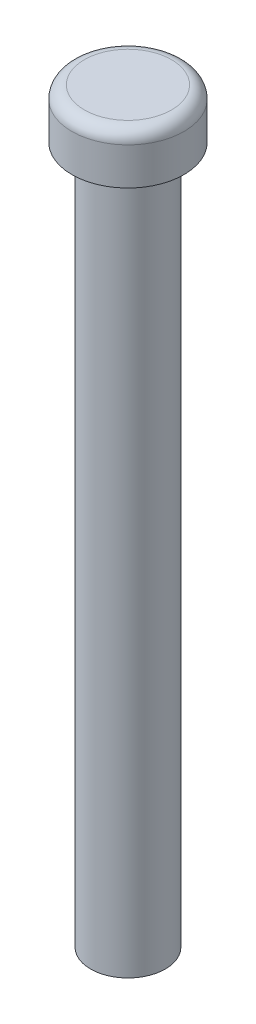
ISO-10303-21;
HEADER;
FILE_DESCRIPTION(('STEP AP214'),'2;1');
FILE_NAME('part.step','',(''),(''),'','','');
FILE_SCHEMA(('AUTOMOTIVE_DESIGN { 1 0 10303 214 1 1 1 1 }'));
ENDSEC;
DATA;
#1=APPLICATION_CONTEXT('core data for automotive mechanical design processes');
#2=APPLICATION_PROTOCOL_DEFINITION('international standard','automotive_design',2000,#1);
#3=PRODUCT_CONTEXT('',#1,'mechanical');
#4=PRODUCT('Part','Part','',(#3));
#5=PRODUCT_RELATED_PRODUCT_CATEGORY('part','',(#4));
#6=PRODUCT_DEFINITION_FORMATION('','',#4);
#7=PRODUCT_DEFINITION_CONTEXT('part definition',#1,'design');
#8=PRODUCT_DEFINITION('design','',#6,#7);
#9=PRODUCT_DEFINITION_SHAPE('','',#8);
#10=(LENGTH_UNIT() NAMED_UNIT(*) SI_UNIT(.MILLI.,.METRE.));
#11=(NAMED_UNIT(*) PLANE_ANGLE_UNIT() SI_UNIT($,.RADIAN.));
#12=(NAMED_UNIT(*) SI_UNIT($,.STERADIAN.) SOLID_ANGLE_UNIT());
#13=UNCERTAINTY_MEASURE_WITH_UNIT(LENGTH_MEASURE(1.E-05),#10,'distance_accuracy_value','');
#14=(GEOMETRIC_REPRESENTATION_CONTEXT(3) GLOBAL_UNCERTAINTY_ASSIGNED_CONTEXT((#13)) GLOBAL_UNIT_ASSIGNED_CONTEXT((#10,
#11,#12)) REPRESENTATION_CONTEXT('',''));
#15=CARTESIAN_POINT('',(0.,0.,0.));
#16=DIRECTION('',(0.,0.,1.));
#17=DIRECTION('',(1.,0.,0.));
#18=AXIS2_PLACEMENT_3D('',#15,#16,#17);
#19=CARTESIAN_POINT('',(0.,28.,0.));
#20=DIRECTION('',(0.,-1.,0.));
#21=DIRECTION('',(0.,0.,-1.));
#22=AXIS2_PLACEMENT_3D('',#19,#20,#21);
#23=CYLINDRICAL_SURFACE('',#22,1.5);
#24=CARTESIAN_POINT('',(0.,28.,0.));
#25=DIRECTION('',(0.,1.,0.));
#26=DIRECTION('',(0.,0.,1.));
#27=AXIS2_PLACEMENT_3D('',#24,#25,#26);
#28=CIRCLE('',#27,1.5);
#29=CARTESIAN_POINT('',(0.,28.,1.5));
#30=VERTEX_POINT('',#29);
#31=EDGE_CURVE('E42',#30,#30,#28,.T.);
#32=ORIENTED_EDGE('',*,*,#31,.F.);
#33=EDGE_LOOP('',(#32));
#34=FACE_BOUND('',#33,.T.);
#35=CARTESIAN_POINT('',(0.,0.,0.));
#36=DIRECTION('',(0.,1.,0.));
#37=DIRECTION('',(0.,0.,1.));
#38=AXIS2_PLACEMENT_3D('',#35,#36,#37);
#39=CIRCLE('',#38,1.5);
#40=CARTESIAN_POINT('',(0.,0.,1.5));
#41=VERTEX_POINT('',#40);
#42=EDGE_CURVE('E46',#41,#41,#39,.T.);
#43=ORIENTED_EDGE('',*,*,#42,.T.);
#44=EDGE_LOOP('',(#43));
#45=FACE_BOUND('',#44,.T.);
#46=ADVANCED_FACE('F31',(#34,#45),#23,.T.);
#47=CARTESIAN_POINT('',(0.,0.,0.));
#48=DIRECTION('',(0.,1.,0.));
#49=DIRECTION('',(0.,0.,1.));
#50=AXIS2_PLACEMENT_3D('',#47,#48,#49);
#51=PLANE('',#50);
#52=ORIENTED_EDGE('',*,*,#42,.F.);
#53=EDGE_LOOP('',(#52));
#54=FACE_BOUND('',#53,.T.);
#55=ADVANCED_FACE('F70',(#54),#51,.F.);
#56=CARTESIAN_POINT('',(0.,30.,0.));
#57=DIRECTION('',(0.,-1.,0.));
#58=DIRECTION('',(0.,0.,-1.));
#59=AXIS2_PLACEMENT_3D('',#56,#57,#58);
#60=CYLINDRICAL_SURFACE('',#59,2.25);
#61=CARTESIAN_POINT('',(0.,29.5,0.));
#62=DIRECTION('',(0.,1.,0.));
#63=DIRECTION('',(0.,0.,1.));
#64=AXIS2_PLACEMENT_3D('',#61,#62,#63);
#65=CIRCLE('',#64,2.25);
#66=CARTESIAN_POINT('',(0.,29.5,2.25));
#67=VERTEX_POINT('',#66);
#68=EDGE_CURVE('E10',#67,#67,#65,.F.);
#69=ORIENTED_EDGE('',*,*,#68,.T.);
#70=EDGE_LOOP('',(#69));
#71=FACE_BOUND('',#70,.T.);
#72=CARTESIAN_POINT('',(0.,28.,0.));
#73=DIRECTION('',(0.,1.,0.));
#74=DIRECTION('',(0.,0.,1.));
#75=AXIS2_PLACEMENT_3D('',#72,#73,#74);
#76=CIRCLE('',#75,2.25);
#77=CARTESIAN_POINT('',(0.,28.,2.25));
#78=VERTEX_POINT('',#77);
#79=EDGE_CURVE('E50',#78,#78,#76,.T.);
#80=ORIENTED_EDGE('',*,*,#79,.T.);
#81=EDGE_LOOP('',(#80));
#82=FACE_BOUND('',#81,.T.);
#83=ADVANCED_FACE('F55',(#71,#82),#60,.T.);
#84=CARTESIAN_POINT('',(0.,30.,0.));
#85=DIRECTION('',(0.,1.,0.));
#86=DIRECTION('',(0.,0.,1.));
#87=AXIS2_PLACEMENT_3D('',#84,#85,#86);
#88=PLANE('',#87);
#89=CARTESIAN_POINT('',(0.,30.,0.));
#90=DIRECTION('',(0.,1.,0.));
#91=DIRECTION('',(0.,0.,1.));
#92=AXIS2_PLACEMENT_3D('',#89,#90,#91);
#93=CIRCLE('',#92,1.75);
#94=CARTESIAN_POINT('',(0.,30.,1.75));
#95=VERTEX_POINT('',#94);
#96=EDGE_CURVE('E38',#95,#95,#93,.T.);
#97=ORIENTED_EDGE('',*,*,#96,.T.);
#98=EDGE_LOOP('',(#97));
#99=FACE_BOUND('',#98,.T.);
#100=ADVANCED_FACE('F59',(#99),#88,.T.);
#101=CARTESIAN_POINT('',(0.,28.,0.));
#102=DIRECTION('',(0.,1.,0.));
#103=DIRECTION('',(0.,0.,1.));
#104=AXIS2_PLACEMENT_3D('',#101,#102,#103);
#105=PLANE('',#104);
#106=ORIENTED_EDGE('',*,*,#31,.T.);
#107=EDGE_LOOP('',(#106));
#108=FACE_BOUND('',#107,.T.);
#109=ORIENTED_EDGE('',*,*,#79,.F.);
#110=EDGE_LOOP('',(#109));
#111=FACE_BOUND('',#110,.T.);
#112=ADVANCED_FACE('F57',(#108,#111),#105,.F.);
#113=CARTESIAN_POINT('',(0.,29.5,0.));
#114=DIRECTION('',(0.,1.,0.));
#115=DIRECTION('',(0.,0.,1.));
#116=AXIS2_PLACEMENT_3D('',#113,#114,#115);
#117=TOROIDAL_SURFACE('',#116,1.75,0.5);
#118=ORIENTED_EDGE('',*,*,#68,.F.);
#119=EDGE_LOOP('',(#118));
#120=FACE_BOUND('',#119,.T.);
#121=ORIENTED_EDGE('',*,*,#96,.F.);
#122=EDGE_LOOP('',(#121));
#123=FACE_BOUND('',#122,.T.);
#124=ADVANCED_FACE('F33',(#120,#123),#117,.T.);
#125=CLOSED_SHELL('',(#46,#55,#83,#100,#112,#124));
#126=MANIFOLD_SOLID_BREP('B2',#125);
#127=ADVANCED_BREP_SHAPE_REPRESENTATION('',(#18,#126),#14);
#128=SHAPE_DEFINITION_REPRESENTATION(#9,#127);
ENDSEC;
END-ISO-10303-21;
